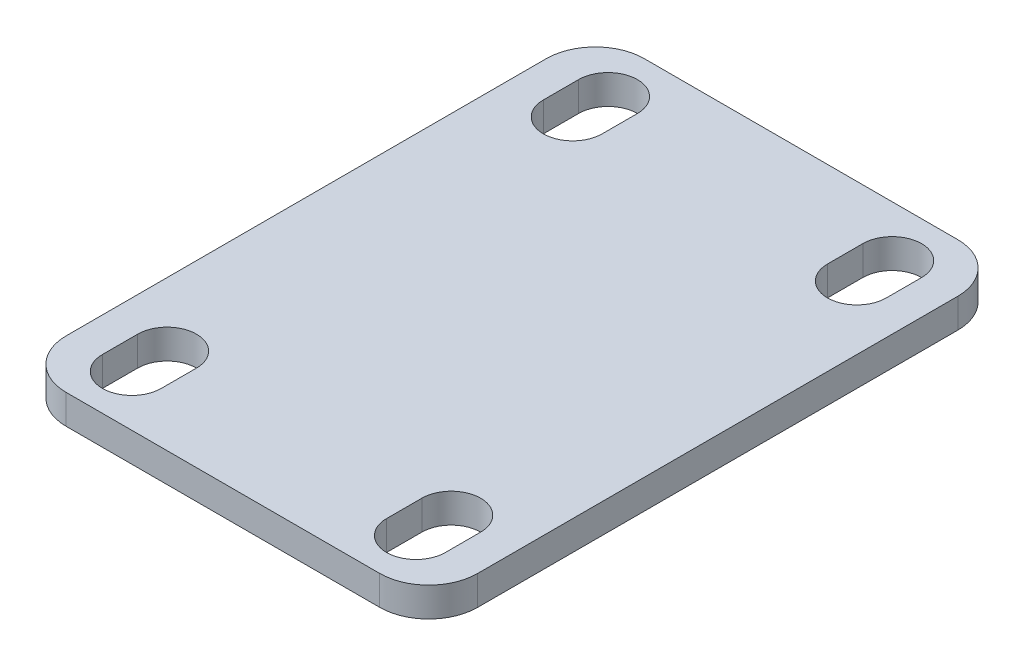
ISO-10303-21;
HEADER;
FILE_DESCRIPTION(('STEP AP214'),'2;1');
FILE_NAME('part.step','',(''),(''),'','','');
FILE_SCHEMA(('AUTOMOTIVE_DESIGN { 1 0 10303 214 1 1 1 1 }'));
ENDSEC;
DATA;
#1=APPLICATION_CONTEXT('core data for automotive mechanical design processes');
#2=APPLICATION_PROTOCOL_DEFINITION('international standard','automotive_design',2000,#1);
#3=PRODUCT_CONTEXT('',#1,'mechanical');
#4=PRODUCT('Part','Part','',(#3));
#5=PRODUCT_RELATED_PRODUCT_CATEGORY('part','',(#4));
#6=PRODUCT_DEFINITION_FORMATION('','',#4);
#7=PRODUCT_DEFINITION_CONTEXT('part definition',#1,'design');
#8=PRODUCT_DEFINITION('design','',#6,#7);
#9=PRODUCT_DEFINITION_SHAPE('','',#8);
#10=(LENGTH_UNIT() NAMED_UNIT(*) SI_UNIT(.MILLI.,.METRE.));
#11=(NAMED_UNIT(*) PLANE_ANGLE_UNIT() SI_UNIT($,.RADIAN.));
#12=(NAMED_UNIT(*) SI_UNIT($,.STERADIAN.) SOLID_ANGLE_UNIT());
#13=UNCERTAINTY_MEASURE_WITH_UNIT(LENGTH_MEASURE(1.E-05),#10,'distance_accuracy_value','');
#14=(GEOMETRIC_REPRESENTATION_CONTEXT(3) GLOBAL_UNCERTAINTY_ASSIGNED_CONTEXT((#13)) GLOBAL_UNIT_ASSIGNED_CONTEXT((#10,
#11,#12)) REPRESENTATION_CONTEXT('',''));
#15=CARTESIAN_POINT('',(0.,0.,0.));
#16=DIRECTION('',(0.,0.,1.));
#17=DIRECTION('',(1.,0.,0.));
#18=AXIS2_PLACEMENT_3D('',#15,#16,#17);
#19=CARTESIAN_POINT('',(16.,3.,24.5));
#20=DIRECTION('',(0.,1.,0.));
#21=DIRECTION('',(0.,0.,1.));
#22=AXIS2_PLACEMENT_3D('',#19,#20,#21);
#23=PLANE('',#22);
#24=CARTESIAN_POINT('',(16.,3.,24.5));
#25=DIRECTION('',(0.,1.,0.));
#26=DIRECTION('',(0.,0.,1.));
#27=AXIS2_PLACEMENT_3D('',#24,#25,#26);
#28=CIRCLE('',#27,5.);
#29=CARTESIAN_POINT('',(16.,3.,29.5));
#30=VERTEX_POINT('',#29);
#31=CARTESIAN_POINT('',(21.,3.,24.5));
#32=VERTEX_POINT('',#31);
#33=EDGE_CURVE('E326',#30,#32,#28,.T.);
#34=ORIENTED_EDGE('',*,*,#33,.T.);
#35=DIRECTION('',(0.,0.,-1.));
#36=VECTOR('',#35,1.);
#37=CARTESIAN_POINT('',(21.,3.,24.5));
#38=LINE('',#37,#36);
#39=CARTESIAN_POINT('',(21.,3.,-24.5));
#40=VERTEX_POINT('',#39);
#41=EDGE_CURVE('E329',#32,#40,#38,.T.);
#42=ORIENTED_EDGE('',*,*,#41,.T.);
#43=CARTESIAN_POINT('',(16.,3.,-24.5));
#44=DIRECTION('',(0.,1.,0.));
#45=DIRECTION('',(0.,0.,1.));
#46=AXIS2_PLACEMENT_3D('',#43,#44,#45);
#47=CIRCLE('',#46,5.);
#48=CARTESIAN_POINT('',(16.,3.,-29.5));
#49=VERTEX_POINT('',#48);
#50=EDGE_CURVE('E332',#40,#49,#47,.T.);
#51=ORIENTED_EDGE('',*,*,#50,.T.);
#52=DIRECTION('',(-1.,0.,0.));
#53=VECTOR('',#52,1.);
#54=CARTESIAN_POINT('',(16.,3.,-29.5));
#55=LINE('',#54,#53);
#56=CARTESIAN_POINT('',(-16.,3.,-29.5));
#57=VERTEX_POINT('',#56);
#58=EDGE_CURVE('E334',#49,#57,#55,.T.);
#59=ORIENTED_EDGE('',*,*,#58,.T.);
#60=CARTESIAN_POINT('',(-16.,3.,-24.5));
#61=DIRECTION('',(0.,1.,0.));
#62=DIRECTION('',(0.,0.,1.));
#63=AXIS2_PLACEMENT_3D('',#60,#61,#62);
#64=CIRCLE('',#63,5.);
#65=CARTESIAN_POINT('',(-21.,3.,-24.5));
#66=VERTEX_POINT('',#65);
#67=EDGE_CURVE('E336',#57,#66,#64,.T.);
#68=ORIENTED_EDGE('',*,*,#67,.T.);
#69=DIRECTION('',(0.,0.,1.));
#70=VECTOR('',#69,1.);
#71=CARTESIAN_POINT('',(-21.,3.,24.5));
#72=LINE('',#71,#70);
#73=CARTESIAN_POINT('',(-21.,3.,24.5));
#74=VERTEX_POINT('',#73);
#75=EDGE_CURVE('E338',#66,#74,#72,.T.);
#76=ORIENTED_EDGE('',*,*,#75,.T.);
#77=CARTESIAN_POINT('',(-16.,3.,24.5));
#78=DIRECTION('',(0.,1.,0.));
#79=DIRECTION('',(0.,0.,-1.));
#80=AXIS2_PLACEMENT_3D('',#77,#78,#79);
#81=CIRCLE('',#80,5.);
#82=CARTESIAN_POINT('',(-16.,3.,29.5));
#83=VERTEX_POINT('',#82);
#84=EDGE_CURVE('E340',#74,#83,#81,.T.);
#85=ORIENTED_EDGE('',*,*,#84,.T.);
#86=DIRECTION('',(1.,0.,0.));
#87=VECTOR('',#86,1.);
#88=CARTESIAN_POINT('',(16.,3.,29.5));
#89=LINE('',#88,#87);
#90=EDGE_CURVE('E342',#83,#30,#89,.T.);
#91=ORIENTED_EDGE('',*,*,#90,.T.);
#92=EDGE_LOOP('',(#34,#42,#51,#59,#68,#76,#85,#91));
#93=FACE_BOUND('',#92,.T.);
#94=DIRECTION('',(0.,0.,1.));
#95=VECTOR('',#94,1.);
#96=CARTESIAN_POINT('',(-17.5,3.,-24.3));
#97=LINE('',#96,#95);
#98=CARTESIAN_POINT('',(-17.5,3.,-24.3));
#99=VERTEX_POINT('',#98);
#100=CARTESIAN_POINT('',(-17.5,3.,-20.7));
#101=VERTEX_POINT('',#100);
#102=EDGE_CURVE('E297',#99,#101,#97,.T.);
#103=ORIENTED_EDGE('',*,*,#102,.F.);
#104=CARTESIAN_POINT('',(-14.5,3.,-24.3));
#105=DIRECTION('',(0.,1.,0.));
#106=DIRECTION('',(0.,0.,1.));
#107=AXIS2_PLACEMENT_3D('',#104,#105,#106);
#108=CIRCLE('',#107,3.);
#109=CARTESIAN_POINT('',(-11.5,3.,-24.3));
#110=VERTEX_POINT('',#109);
#111=EDGE_CURVE('E295',#110,#99,#108,.T.);
#112=ORIENTED_EDGE('',*,*,#111,.F.);
#113=DIRECTION('',(0.,0.,-1.));
#114=VECTOR('',#113,1.);
#115=CARTESIAN_POINT('',(-11.5,3.,-24.3));
#116=LINE('',#115,#114);
#117=CARTESIAN_POINT('',(-11.5,3.,-20.7));
#118=VERTEX_POINT('',#117);
#119=EDGE_CURVE('E303',#118,#110,#116,.T.);
#120=ORIENTED_EDGE('',*,*,#119,.F.);
#121=CARTESIAN_POINT('',(-14.5,3.,-20.7));
#122=DIRECTION('',(0.,1.,0.));
#123=DIRECTION('',(0.,0.,1.));
#124=AXIS2_PLACEMENT_3D('',#121,#122,#123);
#125=CIRCLE('',#124,3.);
#126=EDGE_CURVE('E300',#101,#118,#125,.T.);
#127=ORIENTED_EDGE('',*,*,#126,.F.);
#128=EDGE_LOOP('',(#103,#112,#120,#127));
#129=FACE_BOUND('',#128,.T.);
#130=DIRECTION('',(0.,0.,1.));
#131=VECTOR('',#130,1.);
#132=CARTESIAN_POINT('',(11.5,3.,-24.3));
#133=LINE('',#132,#131);
#134=CARTESIAN_POINT('',(11.5,3.,-24.3));
#135=VERTEX_POINT('',#134);
#136=CARTESIAN_POINT('',(11.5,3.,-20.7));
#137=VERTEX_POINT('',#136);
#138=EDGE_CURVE('E266',#135,#137,#133,.T.);
#139=ORIENTED_EDGE('',*,*,#138,.F.);
#140=CARTESIAN_POINT('',(14.5,3.,-24.3));
#141=DIRECTION('',(0.,1.,0.));
#142=DIRECTION('',(0.,0.,-1.));
#143=AXIS2_PLACEMENT_3D('',#140,#141,#142);
#144=CIRCLE('',#143,3.);
#145=CARTESIAN_POINT('',(17.5,3.,-24.3));
#146=VERTEX_POINT('',#145);
#147=EDGE_CURVE('E264',#146,#135,#144,.T.);
#148=ORIENTED_EDGE('',*,*,#147,.F.);
#149=DIRECTION('',(0.,0.,-1.));
#150=VECTOR('',#149,1.);
#151=CARTESIAN_POINT('',(17.5,3.,-24.3));
#152=LINE('',#151,#150);
#153=CARTESIAN_POINT('',(17.5,3.,-20.7));
#154=VERTEX_POINT('',#153);
#155=EDGE_CURVE('E272',#154,#146,#152,.T.);
#156=ORIENTED_EDGE('',*,*,#155,.F.);
#157=CARTESIAN_POINT('',(14.5,3.,-20.7));
#158=DIRECTION('',(0.,1.,0.));
#159=DIRECTION('',(0.,0.,-1.));
#160=AXIS2_PLACEMENT_3D('',#157,#158,#159);
#161=CIRCLE('',#160,3.00000000000001);
#162=EDGE_CURVE('E269',#137,#154,#161,.T.);
#163=ORIENTED_EDGE('',*,*,#162,.F.);
#164=EDGE_LOOP('',(#139,#148,#156,#163));
#165=FACE_BOUND('',#164,.T.);
#166=DIRECTION('',(0.,0.,-1.));
#167=VECTOR('',#166,1.);
#168=CARTESIAN_POINT('',(-11.5,3.,24.3));
#169=LINE('',#168,#167);
#170=CARTESIAN_POINT('',(-11.5,3.,24.3));
#171=VERTEX_POINT('',#170);
#172=CARTESIAN_POINT('',(-11.5,3.,20.7));
#173=VERTEX_POINT('',#172);
#174=EDGE_CURVE('E235',#171,#173,#169,.T.);
#175=ORIENTED_EDGE('',*,*,#174,.F.);
#176=CARTESIAN_POINT('',(-14.5,3.,24.3));
#177=DIRECTION('',(0.,1.,0.));
#178=DIRECTION('',(0.,0.,-1.));
#179=AXIS2_PLACEMENT_3D('',#176,#177,#178);
#180=CIRCLE('',#179,3.);
#181=CARTESIAN_POINT('',(-17.5,3.,24.3));
#182=VERTEX_POINT('',#181);
#183=EDGE_CURVE('E233',#182,#171,#180,.T.);
#184=ORIENTED_EDGE('',*,*,#183,.F.);
#185=DIRECTION('',(0.,0.,1.));
#186=VECTOR('',#185,1.);
#187=CARTESIAN_POINT('',(-17.5,3.,24.3));
#188=LINE('',#187,#186);
#189=CARTESIAN_POINT('',(-17.5,3.,20.7));
#190=VERTEX_POINT('',#189);
#191=EDGE_CURVE('E241',#190,#182,#188,.T.);
#192=ORIENTED_EDGE('',*,*,#191,.F.);
#193=CARTESIAN_POINT('',(-14.5,3.,20.7));
#194=DIRECTION('',(0.,1.,0.));
#195=DIRECTION('',(0.,0.,-1.));
#196=AXIS2_PLACEMENT_3D('',#193,#194,#195);
#197=CIRCLE('',#196,3.);
#198=EDGE_CURVE('E238',#173,#190,#197,.T.);
#199=ORIENTED_EDGE('',*,*,#198,.F.);
#200=EDGE_LOOP('',(#175,#184,#192,#199));
#201=FACE_BOUND('',#200,.T.);
#202=DIRECTION('',(0.,0.,-1.));
#203=VECTOR('',#202,1.);
#204=CARTESIAN_POINT('',(17.5,3.,24.3));
#205=LINE('',#204,#203);
#206=CARTESIAN_POINT('',(17.5,3.,24.3));
#207=VERTEX_POINT('',#206);
#208=CARTESIAN_POINT('',(17.5,3.,20.7));
#209=VERTEX_POINT('',#208);
#210=EDGE_CURVE('E203',#207,#209,#205,.T.);
#211=ORIENTED_EDGE('',*,*,#210,.F.);
#212=CARTESIAN_POINT('',(14.5,3.,24.3));
#213=DIRECTION('',(0.,1.,0.));
#214=DIRECTION('',(0.,0.,1.));
#215=AXIS2_PLACEMENT_3D('',#212,#213,#214);
#216=CIRCLE('',#215,3.);
#217=CARTESIAN_POINT('',(11.5,3.,24.3));
#218=VERTEX_POINT('',#217);
#219=EDGE_CURVE('E195',#218,#207,#216,.T.);
#220=ORIENTED_EDGE('',*,*,#219,.F.);
#221=DIRECTION('',(0.,0.,1.));
#222=VECTOR('',#221,1.);
#223=CARTESIAN_POINT('',(11.5,3.,24.3));
#224=LINE('',#223,#222);
#225=CARTESIAN_POINT('',(11.5,3.,20.7));
#226=VERTEX_POINT('',#225);
#227=EDGE_CURVE('E217',#226,#218,#224,.T.);
#228=ORIENTED_EDGE('',*,*,#227,.F.);
#229=CARTESIAN_POINT('',(14.5,3.,20.7));
#230=DIRECTION('',(0.,1.,0.));
#231=DIRECTION('',(0.,0.,1.));
#232=AXIS2_PLACEMENT_3D('',#229,#230,#231);
#233=CIRCLE('',#232,3.);
#234=EDGE_CURVE('E215',#209,#226,#233,.T.);
#235=ORIENTED_EDGE('',*,*,#234,.F.);
#236=EDGE_LOOP('',(#211,#220,#228,#235));
#237=FACE_BOUND('',#236,.T.);
#238=ADVANCED_FACE('F34',(#93,#129,#165,#201,#237),#23,.T.);
#239=CARTESIAN_POINT('',(16.,0.,24.5));
#240=DIRECTION('',(0.,1.,0.));
#241=DIRECTION('',(0.,0.,1.));
#242=AXIS2_PLACEMENT_3D('',#239,#240,#241);
#243=PLANE('',#242);
#244=CARTESIAN_POINT('',(0.,0.,0.));
#245=DIRECTION('',(0.,1.,0.));
#246=DIRECTION('',(0.,0.,1.));
#247=AXIS2_PLACEMENT_3D('',#244,#245,#246);
#248=CIRCLE('',#247,17.5);
#249=CARTESIAN_POINT('',(0.,0.,17.5));
#250=VERTEX_POINT('',#249);
#251=EDGE_CURVE('E11',#250,#250,#248,.F.);
#252=ORIENTED_EDGE('',*,*,#251,.F.);
#253=EDGE_LOOP('',(#252));
#254=FACE_BOUND('',#253,.T.);
#255=CARTESIAN_POINT('',(-14.5,0.,24.3));
#256=DIRECTION('',(0.,1.,0.));
#257=DIRECTION('',(0.,0.,-1.));
#258=AXIS2_PLACEMENT_3D('',#255,#256,#257);
#259=CIRCLE('',#258,3.);
#260=CARTESIAN_POINT('',(-17.5,0.,24.3));
#261=VERTEX_POINT('',#260);
#262=CARTESIAN_POINT('',(-11.5,0.,24.3));
#263=VERTEX_POINT('',#262);
#264=EDGE_CURVE('E211',#261,#263,#259,.T.);
#265=ORIENTED_EDGE('',*,*,#264,.T.);
#266=DIRECTION('',(0.,0.,-1.));
#267=VECTOR('',#266,1.);
#268=CARTESIAN_POINT('',(-11.5,0.,24.3));
#269=LINE('',#268,#267);
#270=CARTESIAN_POINT('',(-11.5,0.,20.7));
#271=VERTEX_POINT('',#270);
#272=EDGE_CURVE('E246',#263,#271,#269,.T.);
#273=ORIENTED_EDGE('',*,*,#272,.T.);
#274=CARTESIAN_POINT('',(-14.5,0.,20.7));
#275=DIRECTION('',(0.,1.,0.));
#276=DIRECTION('',(0.,0.,-1.));
#277=AXIS2_PLACEMENT_3D('',#274,#275,#276);
#278=CIRCLE('',#277,3.);
#279=CARTESIAN_POINT('',(-17.5,0.,20.7));
#280=VERTEX_POINT('',#279);
#281=EDGE_CURVE('E249',#271,#280,#278,.T.);
#282=ORIENTED_EDGE('',*,*,#281,.T.);
#283=DIRECTION('',(0.,0.,1.));
#284=VECTOR('',#283,1.);
#285=CARTESIAN_POINT('',(-17.5,0.,24.3));
#286=LINE('',#285,#284);
#287=EDGE_CURVE('E236',#280,#261,#286,.T.);
#288=ORIENTED_EDGE('',*,*,#287,.T.);
#289=EDGE_LOOP('',(#265,#273,#282,#288));
#290=FACE_BOUND('',#289,.T.);
#291=CARTESIAN_POINT('',(-14.5,0.,-24.3));
#292=DIRECTION('',(0.,1.,0.));
#293=DIRECTION('',(0.,0.,1.));
#294=AXIS2_PLACEMENT_3D('',#291,#292,#293);
#295=CIRCLE('',#294,3.);
#296=CARTESIAN_POINT('',(-11.5,0.,-24.3));
#297=VERTEX_POINT('',#296);
#298=CARTESIAN_POINT('',(-17.5,0.,-24.3));
#299=VERTEX_POINT('',#298);
#300=EDGE_CURVE('E294',#297,#299,#295,.T.);
#301=ORIENTED_EDGE('',*,*,#300,.T.);
#302=DIRECTION('',(0.,0.,1.));
#303=VECTOR('',#302,1.);
#304=CARTESIAN_POINT('',(-17.5,0.,-24.3));
#305=LINE('',#304,#303);
#306=CARTESIAN_POINT('',(-17.5,0.,-20.7));
#307=VERTEX_POINT('',#306);
#308=EDGE_CURVE('E308',#299,#307,#305,.T.);
#309=ORIENTED_EDGE('',*,*,#308,.T.);
#310=CARTESIAN_POINT('',(-14.5,0.,-20.7));
#311=DIRECTION('',(0.,1.,0.));
#312=DIRECTION('',(0.,0.,1.));
#313=AXIS2_PLACEMENT_3D('',#310,#311,#312);
#314=CIRCLE('',#313,3.);
#315=CARTESIAN_POINT('',(-11.5,0.,-20.7));
#316=VERTEX_POINT('',#315);
#317=EDGE_CURVE('E311',#307,#316,#314,.T.);
#318=ORIENTED_EDGE('',*,*,#317,.T.);
#319=DIRECTION('',(0.,0.,-1.));
#320=VECTOR('',#319,1.);
#321=CARTESIAN_POINT('',(-11.5,0.,-24.3));
#322=LINE('',#321,#320);
#323=EDGE_CURVE('E298',#316,#297,#322,.T.);
#324=ORIENTED_EDGE('',*,*,#323,.T.);
#325=EDGE_LOOP('',(#301,#309,#318,#324));
#326=FACE_BOUND('',#325,.T.);
#327=CARTESIAN_POINT('',(16.,0.,24.5));
#328=DIRECTION('',(0.,1.,0.));
#329=DIRECTION('',(0.,0.,1.));
#330=AXIS2_PLACEMENT_3D('',#327,#328,#329);
#331=CIRCLE('',#330,5.);
#332=CARTESIAN_POINT('',(16.,0.,29.5));
#333=VERTEX_POINT('',#332);
#334=CARTESIAN_POINT('',(21.,0.,24.5));
#335=VERTEX_POINT('',#334);
#336=EDGE_CURVE('E325',#333,#335,#331,.T.);
#337=ORIENTED_EDGE('',*,*,#336,.F.);
#338=DIRECTION('',(1.,0.,0.));
#339=VECTOR('',#338,1.);
#340=CARTESIAN_POINT('',(16.,0.,29.5));
#341=LINE('',#340,#339);
#342=CARTESIAN_POINT('',(-16.,0.,29.5));
#343=VERTEX_POINT('',#342);
#344=EDGE_CURVE('E330',#343,#333,#341,.T.);
#345=ORIENTED_EDGE('',*,*,#344,.F.);
#346=CARTESIAN_POINT('',(-16.,0.,24.5));
#347=DIRECTION('',(0.,1.,0.));
#348=DIRECTION('',(0.,0.,-1.));
#349=AXIS2_PLACEMENT_3D('',#346,#347,#348);
#350=CIRCLE('',#349,5.);
#351=CARTESIAN_POINT('',(-21.,0.,24.5));
#352=VERTEX_POINT('',#351);
#353=EDGE_CURVE('E357',#352,#343,#350,.T.);
#354=ORIENTED_EDGE('',*,*,#353,.F.);
#355=DIRECTION('',(0.,0.,1.));
#356=VECTOR('',#355,1.);
#357=CARTESIAN_POINT('',(-21.,0.,24.5));
#358=LINE('',#357,#356);
#359=CARTESIAN_POINT('',(-21.,0.,-24.5));
#360=VERTEX_POINT('',#359);
#361=EDGE_CURVE('E355',#360,#352,#358,.T.);
#362=ORIENTED_EDGE('',*,*,#361,.F.);
#363=CARTESIAN_POINT('',(-16.,0.,-24.5));
#364=DIRECTION('',(0.,1.,0.));
#365=DIRECTION('',(0.,0.,1.));
#366=AXIS2_PLACEMENT_3D('',#363,#364,#365);
#367=CIRCLE('',#366,5.);
#368=CARTESIAN_POINT('',(-16.,0.,-29.5));
#369=VERTEX_POINT('',#368);
#370=EDGE_CURVE('E353',#369,#360,#367,.T.);
#371=ORIENTED_EDGE('',*,*,#370,.F.);
#372=DIRECTION('',(-1.,0.,0.));
#373=VECTOR('',#372,1.);
#374=CARTESIAN_POINT('',(16.,0.,-29.5));
#375=LINE('',#374,#373);
#376=CARTESIAN_POINT('',(16.,0.,-29.5));
#377=VERTEX_POINT('',#376);
#378=EDGE_CURVE('E351',#377,#369,#375,.T.);
#379=ORIENTED_EDGE('',*,*,#378,.F.);
#380=CARTESIAN_POINT('',(16.,0.,-24.5));
#381=DIRECTION('',(0.,1.,0.));
#382=DIRECTION('',(0.,0.,1.));
#383=AXIS2_PLACEMENT_3D('',#380,#381,#382);
#384=CIRCLE('',#383,5.);
#385=CARTESIAN_POINT('',(21.,0.,-24.5));
#386=VERTEX_POINT('',#385);
#387=EDGE_CURVE('E349',#386,#377,#384,.T.);
#388=ORIENTED_EDGE('',*,*,#387,.F.);
#389=DIRECTION('',(0.,0.,-1.));
#390=VECTOR('',#389,1.);
#391=CARTESIAN_POINT('',(21.,0.,24.5));
#392=LINE('',#391,#390);
#393=EDGE_CURVE('E347',#335,#386,#392,.T.);
#394=ORIENTED_EDGE('',*,*,#393,.F.);
#395=EDGE_LOOP('',(#337,#345,#354,#362,#371,#379,#388,#394));
#396=FACE_BOUND('',#395,.T.);
#397=CARTESIAN_POINT('',(14.5,0.,-24.3));
#398=DIRECTION('',(0.,1.,0.));
#399=DIRECTION('',(0.,0.,-1.));
#400=AXIS2_PLACEMENT_3D('',#397,#398,#399);
#401=CIRCLE('',#400,3.);
#402=CARTESIAN_POINT('',(17.5,0.,-24.3));
#403=VERTEX_POINT('',#402);
#404=CARTESIAN_POINT('',(11.5,0.,-24.3));
#405=VERTEX_POINT('',#404);
#406=EDGE_CURVE('E263',#403,#405,#401,.T.);
#407=ORIENTED_EDGE('',*,*,#406,.T.);
#408=DIRECTION('',(0.,0.,1.));
#409=VECTOR('',#408,1.);
#410=CARTESIAN_POINT('',(11.5,0.,-24.3));
#411=LINE('',#410,#409);
#412=CARTESIAN_POINT('',(11.5,0.,-20.7));
#413=VERTEX_POINT('',#412);
#414=EDGE_CURVE('E277',#405,#413,#411,.T.);
#415=ORIENTED_EDGE('',*,*,#414,.T.);
#416=CARTESIAN_POINT('',(14.5,0.,-20.7));
#417=DIRECTION('',(0.,1.,0.));
#418=DIRECTION('',(0.,0.,-1.));
#419=AXIS2_PLACEMENT_3D('',#416,#417,#418);
#420=CIRCLE('',#419,3.00000000000001);
#421=CARTESIAN_POINT('',(17.5,0.,-20.7));
#422=VERTEX_POINT('',#421);
#423=EDGE_CURVE('E280',#413,#422,#420,.T.);
#424=ORIENTED_EDGE('',*,*,#423,.T.);
#425=DIRECTION('',(0.,0.,-1.));
#426=VECTOR('',#425,1.);
#427=CARTESIAN_POINT('',(17.5,0.,-24.3));
#428=LINE('',#427,#426);
#429=EDGE_CURVE('E267',#422,#403,#428,.T.);
#430=ORIENTED_EDGE('',*,*,#429,.T.);
#431=EDGE_LOOP('',(#407,#415,#424,#430));
#432=FACE_BOUND('',#431,.T.);
#433=CARTESIAN_POINT('',(14.5,0.,24.3));
#434=DIRECTION('',(0.,1.,0.));
#435=DIRECTION('',(0.,0.,1.));
#436=AXIS2_PLACEMENT_3D('',#433,#434,#435);
#437=CIRCLE('',#436,3.);
#438=CARTESIAN_POINT('',(11.5,0.,24.3));
#439=VERTEX_POINT('',#438);
#440=CARTESIAN_POINT('',(17.5,0.,24.3));
#441=VERTEX_POINT('',#440);
#442=EDGE_CURVE('E57',#439,#441,#437,.T.);
#443=ORIENTED_EDGE('',*,*,#442,.T.);
#444=DIRECTION('',(0.,0.,-1.));
#445=VECTOR('',#444,1.);
#446=CARTESIAN_POINT('',(17.5,0.,24.3));
#447=LINE('',#446,#445);
#448=CARTESIAN_POINT('',(17.5,0.,20.7));
#449=VERTEX_POINT('',#448);
#450=EDGE_CURVE('E210',#441,#449,#447,.T.);
#451=ORIENTED_EDGE('',*,*,#450,.T.);
#452=CARTESIAN_POINT('',(14.5,0.,20.7));
#453=DIRECTION('',(0.,1.,0.));
#454=DIRECTION('',(0.,0.,1.));
#455=AXIS2_PLACEMENT_3D('',#452,#453,#454);
#456=CIRCLE('',#455,3.);
#457=CARTESIAN_POINT('',(11.5,0.,20.7));
#458=VERTEX_POINT('',#457);
#459=EDGE_CURVE('E225',#449,#458,#456,.T.);
#460=ORIENTED_EDGE('',*,*,#459,.T.);
#461=DIRECTION('',(0.,0.,1.));
#462=VECTOR('',#461,1.);
#463=CARTESIAN_POINT('',(11.5,0.,24.3));
#464=LINE('',#463,#462);
#465=EDGE_CURVE('E204',#458,#439,#464,.T.);
#466=ORIENTED_EDGE('',*,*,#465,.T.);
#467=EDGE_LOOP('',(#443,#451,#460,#466));
#468=FACE_BOUND('',#467,.T.);
#469=ADVANCED_FACE('F390',(#254,#290,#326,#396,#432,#468),#243,.F.);
#470=CARTESIAN_POINT('',(16.,3.,24.5));
#471=DIRECTION('',(0.,-1.,0.));
#472=DIRECTION('',(0.,0.,-1.));
#473=AXIS2_PLACEMENT_3D('',#470,#471,#472);
#474=CYLINDRICAL_SURFACE('',#473,5.);
#475=ORIENTED_EDGE('',*,*,#336,.T.);
#476=DIRECTION('',(0.,-1.,0.));
#477=VECTOR('',#476,1.);
#478=CARTESIAN_POINT('',(21.,3.,24.5));
#479=LINE('',#478,#477);
#480=EDGE_CURVE('E42',#32,#335,#479,.T.);
#481=ORIENTED_EDGE('',*,*,#480,.F.);
#482=ORIENTED_EDGE('',*,*,#33,.F.);
#483=DIRECTION('',(0.,-1.,0.));
#484=VECTOR('',#483,1.);
#485=CARTESIAN_POINT('',(16.,3.,29.5));
#486=LINE('',#485,#484);
#487=EDGE_CURVE('E344',#30,#333,#486,.T.);
#488=ORIENTED_EDGE('',*,*,#487,.T.);
#489=EDGE_LOOP('',(#475,#481,#482,#488));
#490=FACE_BOUND('',#489,.T.);
#491=ADVANCED_FACE('F36',(#490),#474,.T.);
#492=CARTESIAN_POINT('',(21.,3.,24.5));
#493=DIRECTION('',(-1.,0.,0.));
#494=DIRECTION('',(0.,0.,1.));
#495=AXIS2_PLACEMENT_3D('',#492,#493,#494);
#496=PLANE('',#495);
#497=ORIENTED_EDGE('',*,*,#393,.T.);
#498=DIRECTION('',(0.,-1.,0.));
#499=VECTOR('',#498,1.);
#500=CARTESIAN_POINT('',(21.,3.,-24.5));
#501=LINE('',#500,#499);
#502=EDGE_CURVE('E377',#40,#386,#501,.T.);
#503=ORIENTED_EDGE('',*,*,#502,.F.);
#504=ORIENTED_EDGE('',*,*,#41,.F.);
#505=ORIENTED_EDGE('',*,*,#480,.T.);
#506=EDGE_LOOP('',(#497,#503,#504,#505));
#507=FACE_BOUND('',#506,.T.);
#508=ADVANCED_FACE('F382',(#507),#496,.F.);
#509=CARTESIAN_POINT('',(16.,3.,-24.5));
#510=DIRECTION('',(0.,-1.,0.));
#511=DIRECTION('',(0.,0.,-1.));
#512=AXIS2_PLACEMENT_3D('',#509,#510,#511);
#513=CYLINDRICAL_SURFACE('',#512,5.);
#514=ORIENTED_EDGE('',*,*,#387,.T.);
#515=DIRECTION('',(0.,-1.,0.));
#516=VECTOR('',#515,1.);
#517=CARTESIAN_POINT('',(16.,3.,-29.5));
#518=LINE('',#517,#516);
#519=EDGE_CURVE('E374',#49,#377,#518,.T.);
#520=ORIENTED_EDGE('',*,*,#519,.F.);
#521=ORIENTED_EDGE('',*,*,#50,.F.);
#522=ORIENTED_EDGE('',*,*,#502,.T.);
#523=EDGE_LOOP('',(#514,#520,#521,#522));
#524=FACE_BOUND('',#523,.T.);
#525=ADVANCED_FACE('F398',(#524),#513,.T.);
#526=CARTESIAN_POINT('',(16.,3.,-29.5));
#527=DIRECTION('',(0.,0.,1.));
#528=DIRECTION('',(1.,0.,0.));
#529=AXIS2_PLACEMENT_3D('',#526,#527,#528);
#530=PLANE('',#529);
#531=ORIENTED_EDGE('',*,*,#378,.T.);
#532=DIRECTION('',(0.,-1.,0.));
#533=VECTOR('',#532,1.);
#534=CARTESIAN_POINT('',(-16.,3.,-29.5));
#535=LINE('',#534,#533);
#536=EDGE_CURVE('E371',#57,#369,#535,.T.);
#537=ORIENTED_EDGE('',*,*,#536,.F.);
#538=ORIENTED_EDGE('',*,*,#58,.F.);
#539=ORIENTED_EDGE('',*,*,#519,.T.);
#540=EDGE_LOOP('',(#531,#537,#538,#539));
#541=FACE_BOUND('',#540,.T.);
#542=ADVANCED_FACE('F402',(#541),#530,.F.);
#543=CARTESIAN_POINT('',(-16.,3.,-24.5));
#544=DIRECTION('',(0.,-1.,0.));
#545=DIRECTION('',(0.,0.,-1.));
#546=AXIS2_PLACEMENT_3D('',#543,#544,#545);
#547=CYLINDRICAL_SURFACE('',#546,5.);
#548=ORIENTED_EDGE('',*,*,#370,.T.);
#549=DIRECTION('',(0.,-1.,0.));
#550=VECTOR('',#549,1.);
#551=CARTESIAN_POINT('',(-21.,3.,-24.5));
#552=LINE('',#551,#550);
#553=EDGE_CURVE('E368',#66,#360,#552,.T.);
#554=ORIENTED_EDGE('',*,*,#553,.F.);
#555=ORIENTED_EDGE('',*,*,#67,.F.);
#556=ORIENTED_EDGE('',*,*,#536,.T.);
#557=EDGE_LOOP('',(#548,#554,#555,#556));
#558=FACE_BOUND('',#557,.T.);
#559=ADVANCED_FACE('F421',(#558),#547,.T.);
#560=CARTESIAN_POINT('',(-21.,3.,24.5));
#561=DIRECTION('',(1.,0.,0.));
#562=DIRECTION('',(0.,0.,-1.));
#563=AXIS2_PLACEMENT_3D('',#560,#561,#562);
#564=PLANE('',#563);
#565=ORIENTED_EDGE('',*,*,#361,.T.);
#566=DIRECTION('',(0.,-1.,0.));
#567=VECTOR('',#566,1.);
#568=CARTESIAN_POINT('',(-21.,3.,24.5));
#569=LINE('',#568,#567);
#570=EDGE_CURVE('E365',#74,#352,#569,.T.);
#571=ORIENTED_EDGE('',*,*,#570,.F.);
#572=ORIENTED_EDGE('',*,*,#75,.F.);
#573=ORIENTED_EDGE('',*,*,#553,.T.);
#574=EDGE_LOOP('',(#565,#571,#572,#573));
#575=FACE_BOUND('',#574,.T.);
#576=ADVANCED_FACE('F418',(#575),#564,.F.);
#577=CARTESIAN_POINT('',(-16.,3.,24.5));
#578=DIRECTION('',(0.,-1.,0.));
#579=DIRECTION('',(0.,0.,-1.));
#580=AXIS2_PLACEMENT_3D('',#577,#578,#579);
#581=CYLINDRICAL_SURFACE('',#580,5.);
#582=ORIENTED_EDGE('',*,*,#353,.T.);
#583=DIRECTION('',(0.,-1.,0.));
#584=VECTOR('',#583,1.);
#585=CARTESIAN_POINT('',(-16.,3.,29.5));
#586=LINE('',#585,#584);
#587=EDGE_CURVE('E362',#83,#343,#586,.T.);
#588=ORIENTED_EDGE('',*,*,#587,.F.);
#589=ORIENTED_EDGE('',*,*,#84,.F.);
#590=ORIENTED_EDGE('',*,*,#570,.T.);
#591=EDGE_LOOP('',(#582,#588,#589,#590));
#592=FACE_BOUND('',#591,.T.);
#593=ADVANCED_FACE('F414',(#592),#581,.T.);
#594=CARTESIAN_POINT('',(16.,3.,29.5));
#595=DIRECTION('',(0.,0.,-1.));
#596=DIRECTION('',(-1.,0.,0.));
#597=AXIS2_PLACEMENT_3D('',#594,#595,#596);
#598=PLANE('',#597);
#599=ORIENTED_EDGE('',*,*,#344,.T.);
#600=ORIENTED_EDGE('',*,*,#487,.F.);
#601=ORIENTED_EDGE('',*,*,#90,.F.);
#602=ORIENTED_EDGE('',*,*,#587,.T.);
#603=EDGE_LOOP('',(#599,#600,#601,#602));
#604=FACE_BOUND('',#603,.T.);
#605=ADVANCED_FACE('F412',(#604),#598,.F.);
#606=CARTESIAN_POINT('',(-14.5,3.,-24.3));
#607=DIRECTION('',(0.,-1.,0.));
#608=DIRECTION('',(0.,0.,-1.));
#609=AXIS2_PLACEMENT_3D('',#606,#607,#608);
#610=CYLINDRICAL_SURFACE('',#609,3.);
#611=ORIENTED_EDGE('',*,*,#300,.F.);
#612=DIRECTION('',(0.,-1.,0.));
#613=VECTOR('',#612,1.);
#614=CARTESIAN_POINT('',(-11.5,3.,-24.3));
#615=LINE('',#614,#613);
#616=EDGE_CURVE('E305',#110,#297,#615,.T.);
#617=ORIENTED_EDGE('',*,*,#616,.F.);
#618=ORIENTED_EDGE('',*,*,#111,.T.);
#619=DIRECTION('',(0.,-1.,0.));
#620=VECTOR('',#619,1.);
#621=CARTESIAN_POINT('',(-17.5,3.,-24.3));
#622=LINE('',#621,#620);
#623=EDGE_CURVE('E322',#99,#299,#622,.T.);
#624=ORIENTED_EDGE('',*,*,#623,.T.);
#625=EDGE_LOOP('',(#611,#617,#618,#624));
#626=FACE_BOUND('',#625,.T.);
#627=ADVANCED_FACE('F438',(#626),#610,.F.);
#628=CARTESIAN_POINT('',(-17.5,3.,-24.3));
#629=DIRECTION('',(1.,0.,0.));
#630=DIRECTION('',(0.,0.,-1.));
#631=AXIS2_PLACEMENT_3D('',#628,#629,#630);
#632=PLANE('',#631);
#633=ORIENTED_EDGE('',*,*,#308,.F.);
#634=ORIENTED_EDGE('',*,*,#623,.F.);
#635=ORIENTED_EDGE('',*,*,#102,.T.);
#636=DIRECTION('',(0.,-1.,0.));
#637=VECTOR('',#636,1.);
#638=CARTESIAN_POINT('',(-17.5,3.,-20.7));
#639=LINE('',#638,#637);
#640=EDGE_CURVE('E320',#101,#307,#639,.T.);
#641=ORIENTED_EDGE('',*,*,#640,.T.);
#642=EDGE_LOOP('',(#633,#634,#635,#641));
#643=FACE_BOUND('',#642,.T.);
#644=ADVANCED_FACE('F458',(#643),#632,.T.);
#645=CARTESIAN_POINT('',(-14.5,3.,-20.7));
#646=DIRECTION('',(0.,-1.,0.));
#647=DIRECTION('',(0.,0.,-1.));
#648=AXIS2_PLACEMENT_3D('',#645,#646,#647);
#649=CYLINDRICAL_SURFACE('',#648,3.);
#650=ORIENTED_EDGE('',*,*,#317,.F.);
#651=ORIENTED_EDGE('',*,*,#640,.F.);
#652=ORIENTED_EDGE('',*,*,#126,.T.);
#653=DIRECTION('',(0.,-1.,0.));
#654=VECTOR('',#653,1.);
#655=CARTESIAN_POINT('',(-11.5,3.,-20.7));
#656=LINE('',#655,#654);
#657=EDGE_CURVE('E318',#118,#316,#656,.T.);
#658=ORIENTED_EDGE('',*,*,#657,.T.);
#659=EDGE_LOOP('',(#650,#651,#652,#658));
#660=FACE_BOUND('',#659,.T.);
#661=ADVANCED_FACE('F465',(#660),#649,.F.);
#662=CARTESIAN_POINT('',(-11.5,3.,-24.3));
#663=DIRECTION('',(-1.,0.,0.));
#664=DIRECTION('',(0.,0.,1.));
#665=AXIS2_PLACEMENT_3D('',#662,#663,#664);
#666=PLANE('',#665);
#667=ORIENTED_EDGE('',*,*,#323,.F.);
#668=ORIENTED_EDGE('',*,*,#657,.F.);
#669=ORIENTED_EDGE('',*,*,#119,.T.);
#670=ORIENTED_EDGE('',*,*,#616,.T.);
#671=EDGE_LOOP('',(#667,#668,#669,#670));
#672=FACE_BOUND('',#671,.T.);
#673=ADVANCED_FACE('F472',(#672),#666,.T.);
#674=CARTESIAN_POINT('',(14.5,3.,-24.3));
#675=DIRECTION('',(0.,-1.,0.));
#676=DIRECTION('',(0.,0.,-1.));
#677=AXIS2_PLACEMENT_3D('',#674,#675,#676);
#678=CYLINDRICAL_SURFACE('',#677,3.);
#679=ORIENTED_EDGE('',*,*,#406,.F.);
#680=DIRECTION('',(0.,-1.,0.));
#681=VECTOR('',#680,1.);
#682=CARTESIAN_POINT('',(17.5,3.,-24.3));
#683=LINE('',#682,#681);
#684=EDGE_CURVE('E274',#146,#403,#683,.T.);
#685=ORIENTED_EDGE('',*,*,#684,.F.);
#686=ORIENTED_EDGE('',*,*,#147,.T.);
#687=DIRECTION('',(0.,-1.,0.));
#688=VECTOR('',#687,1.);
#689=CARTESIAN_POINT('',(11.5,3.,-24.3));
#690=LINE('',#689,#688);
#691=EDGE_CURVE('E291',#135,#405,#690,.T.);
#692=ORIENTED_EDGE('',*,*,#691,.T.);
#693=EDGE_LOOP('',(#679,#685,#686,#692));
#694=FACE_BOUND('',#693,.T.);
#695=ADVANCED_FACE('F480',(#694),#678,.F.);
#696=CARTESIAN_POINT('',(11.5,3.,-24.3));
#697=DIRECTION('',(1.,0.,0.));
#698=DIRECTION('',(0.,0.,-1.));
#699=AXIS2_PLACEMENT_3D('',#696,#697,#698);
#700=PLANE('',#699);
#701=ORIENTED_EDGE('',*,*,#414,.F.);
#702=ORIENTED_EDGE('',*,*,#691,.F.);
#703=ORIENTED_EDGE('',*,*,#138,.T.);
#704=DIRECTION('',(0.,-1.,0.));
#705=VECTOR('',#704,1.);
#706=CARTESIAN_POINT('',(11.5,3.,-20.7));
#707=LINE('',#706,#705);
#708=EDGE_CURVE('E289',#137,#413,#707,.T.);
#709=ORIENTED_EDGE('',*,*,#708,.T.);
#710=EDGE_LOOP('',(#701,#702,#703,#709));
#711=FACE_BOUND('',#710,.T.);
#712=ADVANCED_FACE('F488',(#711),#700,.T.);
#713=CARTESIAN_POINT('',(14.5,3.,-20.7));
#714=DIRECTION('',(0.,-1.,0.));
#715=DIRECTION('',(0.,0.,-1.));
#716=AXIS2_PLACEMENT_3D('',#713,#714,#715);
#717=CYLINDRICAL_SURFACE('',#716,3.00000000000001);
#718=ORIENTED_EDGE('',*,*,#423,.F.);
#719=ORIENTED_EDGE('',*,*,#708,.F.);
#720=ORIENTED_EDGE('',*,*,#162,.T.);
#721=DIRECTION('',(0.,-1.,0.));
#722=VECTOR('',#721,1.);
#723=CARTESIAN_POINT('',(17.5,3.,-20.7));
#724=LINE('',#723,#722);
#725=EDGE_CURVE('E287',#154,#422,#724,.T.);
#726=ORIENTED_EDGE('',*,*,#725,.T.);
#727=EDGE_LOOP('',(#718,#719,#720,#726));
#728=FACE_BOUND('',#727,.T.);
#729=ADVANCED_FACE('F496',(#728),#717,.F.);
#730=CARTESIAN_POINT('',(17.5,3.,-24.3));
#731=DIRECTION('',(-1.,0.,0.));
#732=DIRECTION('',(0.,0.,1.));
#733=AXIS2_PLACEMENT_3D('',#730,#731,#732);
#734=PLANE('',#733);
#735=ORIENTED_EDGE('',*,*,#429,.F.);
#736=ORIENTED_EDGE('',*,*,#725,.F.);
#737=ORIENTED_EDGE('',*,*,#155,.T.);
#738=ORIENTED_EDGE('',*,*,#684,.T.);
#739=EDGE_LOOP('',(#735,#736,#737,#738));
#740=FACE_BOUND('',#739,.T.);
#741=ADVANCED_FACE('F504',(#740),#734,.T.);
#742=CARTESIAN_POINT('',(-14.5,3.,24.3));
#743=DIRECTION('',(0.,-1.,0.));
#744=DIRECTION('',(0.,0.,-1.));
#745=AXIS2_PLACEMENT_3D('',#742,#743,#744);
#746=CYLINDRICAL_SURFACE('',#745,3.);
#747=ORIENTED_EDGE('',*,*,#264,.F.);
#748=DIRECTION('',(0.,-1.,0.));
#749=VECTOR('',#748,1.);
#750=CARTESIAN_POINT('',(-17.5,3.,24.3));
#751=LINE('',#750,#749);
#752=EDGE_CURVE('E243',#182,#261,#751,.T.);
#753=ORIENTED_EDGE('',*,*,#752,.F.);
#754=ORIENTED_EDGE('',*,*,#183,.T.);
#755=DIRECTION('',(0.,-1.,0.));
#756=VECTOR('',#755,1.);
#757=CARTESIAN_POINT('',(-11.5,3.,24.3));
#758=LINE('',#757,#756);
#759=EDGE_CURVE('E260',#171,#263,#758,.T.);
#760=ORIENTED_EDGE('',*,*,#759,.T.);
#761=EDGE_LOOP('',(#747,#753,#754,#760));
#762=FACE_BOUND('',#761,.T.);
#763=ADVANCED_FACE('F512',(#762),#746,.F.);
#764=CARTESIAN_POINT('',(-11.5,3.,24.3));
#765=DIRECTION('',(-1.,0.,0.));
#766=DIRECTION('',(0.,0.,1.));
#767=AXIS2_PLACEMENT_3D('',#764,#765,#766);
#768=PLANE('',#767);
#769=ORIENTED_EDGE('',*,*,#272,.F.);
#770=ORIENTED_EDGE('',*,*,#759,.F.);
#771=ORIENTED_EDGE('',*,*,#174,.T.);
#772=DIRECTION('',(0.,-1.,0.));
#773=VECTOR('',#772,1.);
#774=CARTESIAN_POINT('',(-11.5,3.,20.7));
#775=LINE('',#774,#773);
#776=EDGE_CURVE('E258',#173,#271,#775,.T.);
#777=ORIENTED_EDGE('',*,*,#776,.T.);
#778=EDGE_LOOP('',(#769,#770,#771,#777));
#779=FACE_BOUND('',#778,.T.);
#780=ADVANCED_FACE('F520',(#779),#768,.T.);
#781=CARTESIAN_POINT('',(-14.5,3.,20.7));
#782=DIRECTION('',(0.,-1.,0.));
#783=DIRECTION('',(0.,0.,-1.));
#784=AXIS2_PLACEMENT_3D('',#781,#782,#783);
#785=CYLINDRICAL_SURFACE('',#784,3.);
#786=ORIENTED_EDGE('',*,*,#281,.F.);
#787=ORIENTED_EDGE('',*,*,#776,.F.);
#788=ORIENTED_EDGE('',*,*,#198,.T.);
#789=DIRECTION('',(0.,-1.,0.));
#790=VECTOR('',#789,1.);
#791=CARTESIAN_POINT('',(-17.5,3.,20.7));
#792=LINE('',#791,#790);
#793=EDGE_CURVE('E256',#190,#280,#792,.T.);
#794=ORIENTED_EDGE('',*,*,#793,.T.);
#795=EDGE_LOOP('',(#786,#787,#788,#794));
#796=FACE_BOUND('',#795,.T.);
#797=ADVANCED_FACE('F528',(#796),#785,.F.);
#798=CARTESIAN_POINT('',(-17.5,3.,24.3));
#799=DIRECTION('',(1.,0.,0.));
#800=DIRECTION('',(0.,0.,-1.));
#801=AXIS2_PLACEMENT_3D('',#798,#799,#800);
#802=PLANE('',#801);
#803=ORIENTED_EDGE('',*,*,#287,.F.);
#804=ORIENTED_EDGE('',*,*,#793,.F.);
#805=ORIENTED_EDGE('',*,*,#191,.T.);
#806=ORIENTED_EDGE('',*,*,#752,.T.);
#807=EDGE_LOOP('',(#803,#804,#805,#806));
#808=FACE_BOUND('',#807,.T.);
#809=ADVANCED_FACE('F536',(#808),#802,.T.);
#810=CARTESIAN_POINT('',(14.5,3.,24.3));
#811=DIRECTION('',(0.,-1.,0.));
#812=DIRECTION('',(0.,0.,-1.));
#813=AXIS2_PLACEMENT_3D('',#810,#811,#812);
#814=CYLINDRICAL_SURFACE('',#813,3.);
#815=ORIENTED_EDGE('',*,*,#442,.F.);
#816=DIRECTION('',(0.,-1.,0.));
#817=VECTOR('',#816,1.);
#818=CARTESIAN_POINT('',(11.5,3.,24.3));
#819=LINE('',#818,#817);
#820=EDGE_CURVE('E199',#218,#439,#819,.T.);
#821=ORIENTED_EDGE('',*,*,#820,.F.);
#822=ORIENTED_EDGE('',*,*,#219,.T.);
#823=DIRECTION('',(0.,-1.,0.));
#824=VECTOR('',#823,1.);
#825=CARTESIAN_POINT('',(17.5,3.,24.3));
#826=LINE('',#825,#824);
#827=EDGE_CURVE('E198',#207,#441,#826,.T.);
#828=ORIENTED_EDGE('',*,*,#827,.T.);
#829=EDGE_LOOP('',(#815,#821,#822,#828));
#830=FACE_BOUND('',#829,.T.);
#831=ADVANCED_FACE('F197',(#830),#814,.F.);
#832=CARTESIAN_POINT('',(17.5,3.,24.3));
#833=DIRECTION('',(-1.,0.,0.));
#834=DIRECTION('',(0.,0.,1.));
#835=AXIS2_PLACEMENT_3D('',#832,#833,#834);
#836=PLANE('',#835);
#837=ORIENTED_EDGE('',*,*,#450,.F.);
#838=ORIENTED_EDGE('',*,*,#827,.F.);
#839=ORIENTED_EDGE('',*,*,#210,.T.);
#840=DIRECTION('',(0.,-1.,0.));
#841=VECTOR('',#840,1.);
#842=CARTESIAN_POINT('',(17.5,3.,20.7));
#843=LINE('',#842,#841);
#844=EDGE_CURVE('E212',#209,#449,#843,.T.);
#845=ORIENTED_EDGE('',*,*,#844,.T.);
#846=EDGE_LOOP('',(#837,#838,#839,#845));
#847=FACE_BOUND('',#846,.T.);
#848=ADVANCED_FACE('F207',(#847),#836,.T.);
#849=CARTESIAN_POINT('',(14.5,3.,20.7));
#850=DIRECTION('',(0.,-1.,0.));
#851=DIRECTION('',(0.,0.,-1.));
#852=AXIS2_PLACEMENT_3D('',#849,#850,#851);
#853=CYLINDRICAL_SURFACE('',#852,3.);
#854=ORIENTED_EDGE('',*,*,#459,.F.);
#855=ORIENTED_EDGE('',*,*,#844,.F.);
#856=ORIENTED_EDGE('',*,*,#234,.T.);
#857=DIRECTION('',(0.,-1.,0.));
#858=VECTOR('',#857,1.);
#859=CARTESIAN_POINT('',(11.5,3.,20.7));
#860=LINE('',#859,#858);
#861=EDGE_CURVE('E49',#226,#458,#860,.T.);
#862=ORIENTED_EDGE('',*,*,#861,.T.);
#863=EDGE_LOOP('',(#854,#855,#856,#862));
#864=FACE_BOUND('',#863,.T.);
#865=ADVANCED_FACE('F557',(#864),#853,.F.);
#866=CARTESIAN_POINT('',(11.5,3.,24.3));
#867=DIRECTION('',(1.,0.,0.));
#868=DIRECTION('',(0.,0.,-1.));
#869=AXIS2_PLACEMENT_3D('',#866,#867,#868);
#870=PLANE('',#869);
#871=ORIENTED_EDGE('',*,*,#465,.F.);
#872=ORIENTED_EDGE('',*,*,#861,.F.);
#873=ORIENTED_EDGE('',*,*,#227,.T.);
#874=ORIENTED_EDGE('',*,*,#820,.T.);
#875=EDGE_LOOP('',(#871,#872,#873,#874));
#876=FACE_BOUND('',#875,.T.);
#877=ADVANCED_FACE('F564',(#876),#870,.T.);
#878=CARTESIAN_POINT('',(0.,-3.,0.));
#879=DIRECTION('',(0.,1.,0.));
#880=DIRECTION('',(0.,0.,1.));
#881=AXIS2_PLACEMENT_3D('',#878,#879,#880);
#882=CYLINDRICAL_SURFACE('',#881,17.5);
#883=CARTESIAN_POINT('',(0.,-3.,0.));
#884=DIRECTION('',(0.,-1.,0.));
#885=DIRECTION('',(0.,0.,-1.));
#886=AXIS2_PLACEMENT_3D('',#883,#884,#885);
#887=CIRCLE('',#886,17.5);
#888=CARTESIAN_POINT('',(0.,-3.,-17.5));
#889=VERTEX_POINT('',#888);
#890=EDGE_CURVE('E223',#889,#889,#887,.T.);
#891=ORIENTED_EDGE('',*,*,#890,.F.);
#892=EDGE_LOOP('',(#891));
#893=FACE_BOUND('',#892,.T.);
#894=ORIENTED_EDGE('',*,*,#251,.T.);
#895=EDGE_LOOP('',(#894));
#896=FACE_BOUND('',#895,.T.);
#897=ADVANCED_FACE('F572',(#893,#896),#882,.T.);
#898=CARTESIAN_POINT('',(0.,-3.,0.));
#899=DIRECTION('',(0.,-1.,0.));
#900=DIRECTION('',(0.,0.,-1.));
#901=AXIS2_PLACEMENT_3D('',#898,#899,#900);
#902=PLANE('',#901);
#903=ORIENTED_EDGE('',*,*,#890,.T.);
#904=EDGE_LOOP('',(#903));
#905=FACE_BOUND('',#904,.T.);
#906=ADVANCED_FACE('F580',(#905),#902,.T.);
#907=CLOSED_SHELL('',(#238,#469,#491,#508,#525,#542,#559,#576,#593,#605,#627,#644,#661,#673,
#695,#712,#729,#741,#763,#780,#797,#809,#831,#848,#865,#877,#897,#906));
#908=MANIFOLD_SOLID_BREP('B2',#907);
#909=ADVANCED_BREP_SHAPE_REPRESENTATION('',(#18,#908),#14);
#910=SHAPE_DEFINITION_REPRESENTATION(#9,#909);
ENDSEC;
END-ISO-10303-21;
